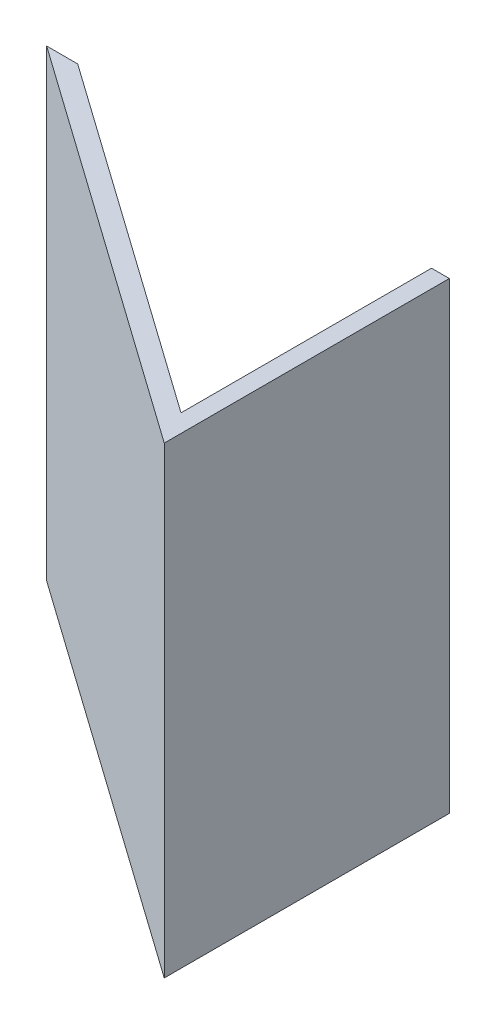
ISO-10303-21;
HEADER;
FILE_DESCRIPTION(('STEP AP214'),'2;1');
FILE_NAME('part.step','',(''),(''),'','','');
FILE_SCHEMA(('AUTOMOTIVE_DESIGN { 1 0 10303 214 1 1 1 1 }'));
ENDSEC;
DATA;
#1=APPLICATION_CONTEXT('core data for automotive mechanical design processes');
#2=APPLICATION_PROTOCOL_DEFINITION('international standard','automotive_design',2000,#1);
#3=PRODUCT_CONTEXT('',#1,'mechanical');
#4=PRODUCT('Part','Part','',(#3));
#5=PRODUCT_RELATED_PRODUCT_CATEGORY('part','',(#4));
#6=PRODUCT_DEFINITION_FORMATION('','',#4);
#7=PRODUCT_DEFINITION_CONTEXT('part definition',#1,'design');
#8=PRODUCT_DEFINITION('design','',#6,#7);
#9=PRODUCT_DEFINITION_SHAPE('','',#8);
#10=(LENGTH_UNIT() NAMED_UNIT(*) SI_UNIT(.MILLI.,.METRE.));
#11=(NAMED_UNIT(*) PLANE_ANGLE_UNIT() SI_UNIT($,.RADIAN.));
#12=(NAMED_UNIT(*) SI_UNIT($,.STERADIAN.) SOLID_ANGLE_UNIT());
#13=UNCERTAINTY_MEASURE_WITH_UNIT(LENGTH_MEASURE(1.E-05),#10,'distance_accuracy_value','');
#14=(GEOMETRIC_REPRESENTATION_CONTEXT(3) GLOBAL_UNCERTAINTY_ASSIGNED_CONTEXT((#13)) GLOBAL_UNIT_ASSIGNED_CONTEXT((#10,
#11,#12)) REPRESENTATION_CONTEXT('',''));
#15=CARTESIAN_POINT('',(0.,0.,0.));
#16=DIRECTION('',(0.,0.,1.));
#17=DIRECTION('',(1.,0.,0.));
#18=AXIS2_PLACEMENT_3D('',#15,#16,#17);
#19=CARTESIAN_POINT('',(-6.72788323187605,82.55,-34.1908451260969));
#20=DIRECTION('',(0.,0.,1.));
#21=DIRECTION('',(1.,0.,0.));
#22=AXIS2_PLACEMENT_3D('',#19,#20,#21);
#23=PLANE('',#22);
#24=DIRECTION('',(-1.,0.,0.));
#25=VECTOR('',#24,1.);
#26=CARTESIAN_POINT('',(-6.72788323187605,0.,-34.1908451260969));
#27=LINE('',#26,#25);
#28=CARTESIAN_POINT('',(-1.20084323187605,0.,-34.1908451260969));
#29=VERTEX_POINT('',#28);
#30=CARTESIAN_POINT('',(-6.72788323187605,0.,-34.1908451260969));
#31=VERTEX_POINT('',#30);
#32=EDGE_CURVE('E117',#29,#31,#27,.T.);
#33=ORIENTED_EDGE('',*,*,#32,.T.);
#34=DIRECTION('',(0.,-1.,0.));
#35=VECTOR('',#34,1.);
#36=CARTESIAN_POINT('',(-6.72788323187605,82.55,-34.1908451260969));
#37=LINE('',#36,#35);
#38=CARTESIAN_POINT('',(-6.72788323187605,82.55,-34.1908451260969));
#39=VERTEX_POINT('',#38);
#40=EDGE_CURVE('E11',#39,#31,#37,.T.);
#41=ORIENTED_EDGE('',*,*,#40,.F.);
#42=DIRECTION('',(-1.,0.,0.));
#43=VECTOR('',#42,1.);
#44=CARTESIAN_POINT('',(-6.72788323187605,82.55,-34.1908451260969));
#45=LINE('',#44,#43);
#46=CARTESIAN_POINT('',(-1.20084323187605,82.55,-34.1908451260969));
#47=VERTEX_POINT('',#46);
#48=EDGE_CURVE('E127',#47,#39,#45,.T.);
#49=ORIENTED_EDGE('',*,*,#48,.F.);
#50=DIRECTION('',(0.,-1.,0.));
#51=VECTOR('',#50,1.);
#52=CARTESIAN_POINT('',(-1.20084323187605,82.55,-34.1908451260969));
#53=LINE('',#52,#51);
#54=EDGE_CURVE('E113',#47,#29,#53,.T.);
#55=ORIENTED_EDGE('',*,*,#54,.T.);
#56=EDGE_LOOP('',(#33,#41,#49,#55));
#57=FACE_BOUND('',#56,.T.);
#58=ADVANCED_FACE('F33',(#57),#23,.F.);
#59=CARTESIAN_POINT('',(-6.72788323187605,82.55,-34.1908451260969));
#60=DIRECTION('',(0.577816924417098,0.,-0.816166405739151));
#61=DIRECTION('',(-0.816166405739152,0.,-0.577816924417098));
#62=AXIS2_PLACEMENT_3D('',#59,#60,#61);
#63=PLANE('',#62);
#64=DIRECTION('',(0.816166405739151,0.,0.577816924417098));
#65=VECTOR('',#64,1.);
#66=CARTESIAN_POINT('',(-6.72788323187605,0.,-34.1908451260969));
#67=LINE('',#66,#65);
#68=CARTESIAN_POINT('',(65.0271167681239,0.,16.6091548739031));
#69=VERTEX_POINT('',#68);
#70=EDGE_CURVE('E120',#31,#69,#67,.T.);
#71=ORIENTED_EDGE('',*,*,#70,.T.);
#72=DIRECTION('',(0.,-1.,0.));
#73=VECTOR('',#72,1.);
#74=CARTESIAN_POINT('',(65.0271167681239,82.55,16.6091548739031));
#75=LINE('',#74,#73);
#76=CARTESIAN_POINT('',(65.0271167681239,82.55,16.6091548739031));
#77=VERTEX_POINT('',#76);
#78=EDGE_CURVE('E41',#77,#69,#75,.T.);
#79=ORIENTED_EDGE('',*,*,#78,.F.);
#80=DIRECTION('',(0.816166405739151,0.,0.577816924417098));
#81=VECTOR('',#80,1.);
#82=CARTESIAN_POINT('',(-6.72788323187605,82.55,-34.1908451260969));
#83=LINE('',#82,#81);
#84=EDGE_CURVE('E86',#39,#77,#83,.T.);
#85=ORIENTED_EDGE('',*,*,#84,.F.);
#86=ORIENTED_EDGE('',*,*,#40,.T.);
#87=EDGE_LOOP('',(#71,#79,#85,#86));
#88=FACE_BOUND('',#87,.T.);
#89=ADVANCED_FACE('F151',(#88),#63,.F.);
#90=CARTESIAN_POINT('',(65.0271167681239,82.55,-34.1908451260969));
#91=DIRECTION('',(-1.,0.,0.));
#92=DIRECTION('',(0.,0.,1.));
#93=AXIS2_PLACEMENT_3D('',#90,#91,#92);
#94=PLANE('',#93);
#95=DIRECTION('',(0.,0.,-1.));
#96=VECTOR('',#95,1.);
#97=CARTESIAN_POINT('',(65.0271167681239,0.,-34.1908451260969));
#98=LINE('',#97,#96);
#99=CARTESIAN_POINT('',(65.0271167681239,0.,-34.1908451260969));
#100=VERTEX_POINT('',#99);
#101=EDGE_CURVE('E122',#69,#100,#98,.T.);
#102=ORIENTED_EDGE('',*,*,#101,.T.);
#103=DIRECTION('',(0.,-1.,0.));
#104=VECTOR('',#103,1.);
#105=CARTESIAN_POINT('',(65.0271167681239,82.55,-34.1908451260969));
#106=LINE('',#105,#104);
#107=CARTESIAN_POINT('',(65.0271167681239,82.55,-34.1908451260969));
#108=VERTEX_POINT('',#107);
#109=EDGE_CURVE('E108',#108,#100,#106,.T.);
#110=ORIENTED_EDGE('',*,*,#109,.F.);
#111=DIRECTION('',(0.,0.,-1.));
#112=VECTOR('',#111,1.);
#113=CARTESIAN_POINT('',(65.0271167681239,82.55,-34.1908451260969));
#114=LINE('',#113,#112);
#115=EDGE_CURVE('E99',#77,#108,#114,.T.);
#116=ORIENTED_EDGE('',*,*,#115,.F.);
#117=ORIENTED_EDGE('',*,*,#78,.T.);
#118=EDGE_LOOP('',(#102,#110,#116,#117));
#119=FACE_BOUND('',#118,.T.);
#120=ADVANCED_FACE('F133',(#119),#94,.F.);
#121=CARTESIAN_POINT('',(65.0271167681239,82.55,-34.1908451260969));
#122=DIRECTION('',(0.,0.,1.));
#123=DIRECTION('',(1.,0.,0.));
#124=AXIS2_PLACEMENT_3D('',#121,#122,#123);
#125=PLANE('',#124);
#126=DIRECTION('',(-1.,0.,0.));
#127=VECTOR('',#126,1.);
#128=CARTESIAN_POINT('',(65.0271167681239,0.,-34.1908451260969));
#129=LINE('',#128,#127);
#130=CARTESIAN_POINT('',(61.8521167681239,0.,-34.1908451260969));
#131=VERTEX_POINT('',#130);
#132=EDGE_CURVE('E107',#100,#131,#129,.T.);
#133=ORIENTED_EDGE('',*,*,#132,.T.);
#134=DIRECTION('',(0.,-1.,0.));
#135=VECTOR('',#134,1.);
#136=CARTESIAN_POINT('',(61.8521167681239,82.55,-34.1908451260969));
#137=LINE('',#136,#135);
#138=CARTESIAN_POINT('',(61.8521167681239,82.55,-34.1908451260969));
#139=VERTEX_POINT('',#138);
#140=EDGE_CURVE('E104',#139,#131,#137,.T.);
#141=ORIENTED_EDGE('',*,*,#140,.F.);
#142=DIRECTION('',(-1.,0.,0.));
#143=VECTOR('',#142,1.);
#144=CARTESIAN_POINT('',(65.0271167681239,82.55,-34.1908451260969));
#145=LINE('',#144,#143);
#146=EDGE_CURVE('E93',#108,#139,#145,.T.);
#147=ORIENTED_EDGE('',*,*,#146,.F.);
#148=ORIENTED_EDGE('',*,*,#109,.T.);
#149=EDGE_LOOP('',(#133,#141,#147,#148));
#150=FACE_BOUND('',#149,.T.);
#151=ADVANCED_FACE('F105',(#150),#125,.F.);
#152=CARTESIAN_POINT('',(61.8521167681239,82.55,-34.1908451260969));
#153=DIRECTION('',(1.,0.,0.));
#154=DIRECTION('',(0.,0.,-1.));
#155=AXIS2_PLACEMENT_3D('',#152,#153,#154);
#156=PLANE('',#155);
#157=DIRECTION('',(0.,0.,1.));
#158=VECTOR('',#157,1.);
#159=CARTESIAN_POINT('',(61.8521167681239,0.,-34.1908451260969));
#160=LINE('',#159,#158);
#161=CARTESIAN_POINT('',(61.8521167681239,0.,10.4496548739031));
#162=VERTEX_POINT('',#161);
#163=EDGE_CURVE('E72',#131,#162,#160,.T.);
#164=ORIENTED_EDGE('',*,*,#163,.T.);
#165=DIRECTION('',(0.,-1.,0.));
#166=VECTOR('',#165,1.);
#167=CARTESIAN_POINT('',(61.8521167681239,82.55,10.4496548739031));
#168=LINE('',#167,#166);
#169=CARTESIAN_POINT('',(61.8521167681239,82.55,10.4496548739031));
#170=VERTEX_POINT('',#169);
#171=EDGE_CURVE('E109',#170,#162,#168,.T.);
#172=ORIENTED_EDGE('',*,*,#171,.F.);
#173=DIRECTION('',(0.,0.,1.));
#174=VECTOR('',#173,1.);
#175=CARTESIAN_POINT('',(61.8521167681239,82.55,-34.1908451260969));
#176=LINE('',#175,#174);
#177=EDGE_CURVE('E97',#139,#170,#176,.T.);
#178=ORIENTED_EDGE('',*,*,#177,.F.);
#179=ORIENTED_EDGE('',*,*,#140,.T.);
#180=EDGE_LOOP('',(#164,#172,#178,#179));
#181=FACE_BOUND('',#180,.T.);
#182=ADVANCED_FACE('F111',(#181),#156,.F.);
#183=CARTESIAN_POINT('',(-1.20084323187605,82.55,-34.1908451260969));
#184=DIRECTION('',(-0.577827584058727,0.,0.816158858985709));
#185=DIRECTION('',(0.816158858985709,0.,0.577827584058727));
#186=AXIS2_PLACEMENT_3D('',#183,#184,#185);
#187=PLANE('',#186);
#188=DIRECTION('',(-0.816158858985709,0.,-0.577827584058727));
#189=VECTOR('',#188,1.);
#190=CARTESIAN_POINT('',(-1.20084323187605,0.,-34.1908451260969));
#191=LINE('',#190,#189);
#192=EDGE_CURVE('E78',#162,#29,#191,.T.);
#193=ORIENTED_EDGE('',*,*,#192,.T.);
#194=ORIENTED_EDGE('',*,*,#54,.F.);
#195=DIRECTION('',(-0.816158858985709,0.,-0.577827584058727));
#196=VECTOR('',#195,1.);
#197=CARTESIAN_POINT('',(-1.20084323187605,82.55,-34.1908451260969));
#198=LINE('',#197,#196);
#199=EDGE_CURVE('E49',#170,#47,#198,.T.);
#200=ORIENTED_EDGE('',*,*,#199,.F.);
#201=ORIENTED_EDGE('',*,*,#171,.T.);
#202=EDGE_LOOP('',(#193,#194,#200,#201));
#203=FACE_BOUND('',#202,.T.);
#204=ADVANCED_FACE('F140',(#203),#187,.F.);
#205=CARTESIAN_POINT('',(0.,82.55,0.));
#206=DIRECTION('',(0.,-1.,0.));
#207=DIRECTION('',(0.,0.,-1.));
#208=AXIS2_PLACEMENT_3D('',#205,#206,#207);
#209=PLANE('',#208);
#210=ORIENTED_EDGE('',*,*,#48,.T.);
#211=ORIENTED_EDGE('',*,*,#84,.T.);
#212=ORIENTED_EDGE('',*,*,#115,.T.);
#213=ORIENTED_EDGE('',*,*,#146,.T.);
#214=ORIENTED_EDGE('',*,*,#177,.T.);
#215=ORIENTED_EDGE('',*,*,#199,.T.);
#216=EDGE_LOOP('',(#210,#211,#212,#213,#214,#215));
#217=FACE_BOUND('',#216,.T.);
#218=ADVANCED_FACE('F95',(#217),#209,.F.);
#219=CARTESIAN_POINT('',(0.,0.,0.));
#220=DIRECTION('',(0.,-1.,0.));
#221=DIRECTION('',(0.,0.,-1.));
#222=AXIS2_PLACEMENT_3D('',#219,#220,#221);
#223=PLANE('',#222);
#224=ORIENTED_EDGE('',*,*,#32,.F.);
#225=ORIENTED_EDGE('',*,*,#192,.F.);
#226=ORIENTED_EDGE('',*,*,#163,.F.);
#227=ORIENTED_EDGE('',*,*,#132,.F.);
#228=ORIENTED_EDGE('',*,*,#101,.F.);
#229=ORIENTED_EDGE('',*,*,#70,.F.);
#230=EDGE_LOOP('',(#224,#225,#226,#227,#228,#229));
#231=FACE_BOUND('',#230,.T.);
#232=ADVANCED_FACE('F136',(#231),#223,.T.);
#233=CLOSED_SHELL('',(#58,#89,#120,#151,#182,#204,#218,#232));
#234=MANIFOLD_SOLID_BREP('B2',#233);
#235=ADVANCED_BREP_SHAPE_REPRESENTATION('',(#18,#234),#14);
#236=SHAPE_DEFINITION_REPRESENTATION(#9,#235);
ENDSEC;
END-ISO-10303-21;
